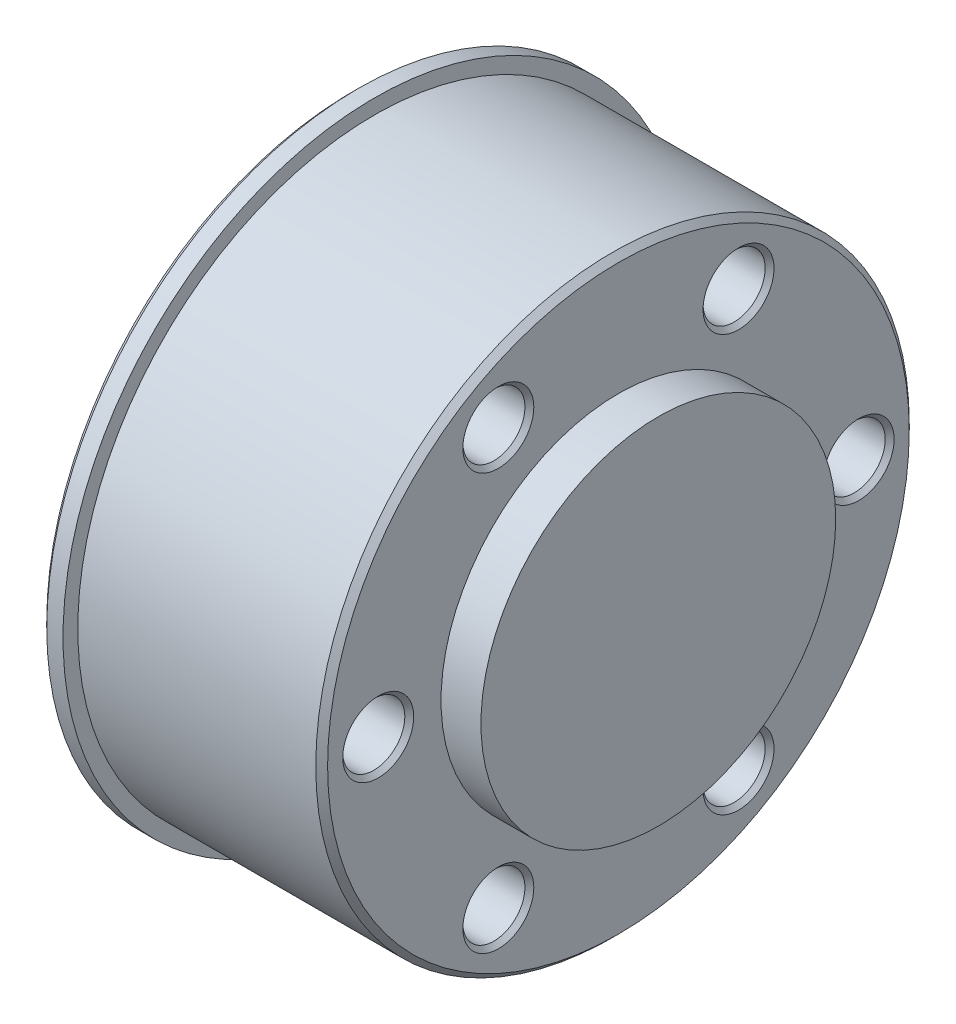
ISO-10303-21;
HEADER;
FILE_DESCRIPTION(('STEP AP214'),'2;1');
FILE_NAME('part.step','',(''),(''),'','','');
FILE_SCHEMA(('AUTOMOTIVE_DESIGN { 1 0 10303 214 1 1 1 1 }'));
ENDSEC;
DATA;
#1=APPLICATION_CONTEXT('core data for automotive mechanical design processes');
#2=APPLICATION_PROTOCOL_DEFINITION('international standard','automotive_design',2000,#1);
#3=PRODUCT_CONTEXT('',#1,'mechanical');
#4=PRODUCT('Part','Part','',(#3));
#5=PRODUCT_RELATED_PRODUCT_CATEGORY('part','',(#4));
#6=PRODUCT_DEFINITION_FORMATION('','',#4);
#7=PRODUCT_DEFINITION_CONTEXT('part definition',#1,'design');
#8=PRODUCT_DEFINITION('design','',#6,#7);
#9=PRODUCT_DEFINITION_SHAPE('','',#8);
#10=(LENGTH_UNIT() NAMED_UNIT(*) SI_UNIT(.MILLI.,.METRE.));
#11=(NAMED_UNIT(*) PLANE_ANGLE_UNIT() SI_UNIT($,.RADIAN.));
#12=(NAMED_UNIT(*) SI_UNIT($,.STERADIAN.) SOLID_ANGLE_UNIT());
#13=UNCERTAINTY_MEASURE_WITH_UNIT(LENGTH_MEASURE(1.E-05),#10,'distance_accuracy_value','');
#14=(GEOMETRIC_REPRESENTATION_CONTEXT(3) GLOBAL_UNCERTAINTY_ASSIGNED_CONTEXT((#13)) GLOBAL_UNIT_ASSIGNED_CONTEXT((#10,
#11,#12)) REPRESENTATION_CONTEXT('',''));
#15=CARTESIAN_POINT('',(0.,0.,0.));
#16=DIRECTION('',(0.,0.,1.));
#17=DIRECTION('',(1.,0.,0.));
#18=AXIS2_PLACEMENT_3D('',#15,#16,#17);
#19=CARTESIAN_POINT('',(0.,0.,0.));
#20=DIRECTION('',(1.,0.,0.));
#21=DIRECTION('',(0.,0.,-1.));
#22=AXIS2_PLACEMENT_3D('',#19,#20,#21);
#23=PLANE('',#22);
#24=CARTESIAN_POINT('',(0.,0.,0.));
#25=DIRECTION('',(1.,0.,0.));
#26=DIRECTION('',(0.,0.,-1.));
#27=AXIS2_PLACEMENT_3D('',#24,#25,#26);
#28=CIRCLE('',#27,12.);
#29=CARTESIAN_POINT('',(0.,0.,-12.));
#30=VERTEX_POINT('',#29);
#31=EDGE_CURVE('E174',#30,#30,#28,.T.);
#32=ORIENTED_EDGE('',*,*,#31,.T.);
#33=EDGE_LOOP('',(#32));
#34=FACE_BOUND('',#33,.T.);
#35=ADVANCED_FACE('F45',(#34),#23,.T.);
#36=CARTESIAN_POINT('',(0.,0.,0.));
#37=DIRECTION('',(1.,0.,0.));
#38=DIRECTION('',(0.,0.,-1.));
#39=AXIS2_PLACEMENT_3D('',#36,#37,#38);
#40=CYLINDRICAL_SURFACE('',#39,12.);
#41=CARTESIAN_POINT('',(-2.7,0.,0.));
#42=DIRECTION('',(1.,0.,0.));
#43=DIRECTION('',(0.,0.,-1.));
#44=AXIS2_PLACEMENT_3D('',#41,#42,#43);
#45=CIRCLE('',#44,12.);
#46=CARTESIAN_POINT('',(-2.7,0.,-12.));
#47=VERTEX_POINT('',#46);
#48=EDGE_CURVE('E178',#47,#47,#45,.T.);
#49=ORIENTED_EDGE('',*,*,#48,.T.);
#50=EDGE_LOOP('',(#49));
#51=FACE_BOUND('',#50,.T.);
#52=ORIENTED_EDGE('',*,*,#31,.F.);
#53=EDGE_LOOP('',(#52));
#54=FACE_BOUND('',#53,.T.);
#55=ADVANCED_FACE('F270',(#51,#54),#40,.T.);
#56=CARTESIAN_POINT('',(-2.7,0.,-12.));
#57=DIRECTION('',(1.,0.,0.));
#58=DIRECTION('',(0.,0.,-1.));
#59=AXIS2_PLACEMENT_3D('',#56,#57,#58);
#60=PLANE('',#59);
#61=CARTESIAN_POINT('',(-2.7,-14.0729128114974,-8.12499999999992));
#62=DIRECTION('',(1.,0.,0.));
#63=DIRECTION('',(0.,0.,-1.));
#64=AXIS2_PLACEMENT_3D('',#61,#62,#63);
#65=CIRCLE('',#64,2.40000000000015);
#66=CARTESIAN_POINT('',(-2.7,-14.0729128114974,-10.5250000000001));
#67=VERTEX_POINT('',#66);
#68=EDGE_CURVE('E82',#67,#67,#65,.F.);
#69=ORIENTED_EDGE('',*,*,#68,.T.);
#70=EDGE_LOOP('',(#69));
#71=FACE_BOUND('',#70,.T.);
#72=CARTESIAN_POINT('',(-2.7,-2.4980018054066E-13,-16.2500000000001));
#73=DIRECTION('',(1.,0.,0.));
#74=DIRECTION('',(0.,0.,-1.));
#75=AXIS2_PLACEMENT_3D('',#72,#73,#74);
#76=CIRCLE('',#75,2.39999999999988);
#77=CARTESIAN_POINT('',(-2.7,-2.4980018054066E-13,-18.65));
#78=VERTEX_POINT('',#77);
#79=EDGE_CURVE('E86',#78,#78,#76,.F.);
#80=ORIENTED_EDGE('',*,*,#79,.T.);
#81=EDGE_LOOP('',(#80));
#82=FACE_BOUND('',#81,.T.);
#83=CARTESIAN_POINT('',(-2.7,14.072912811497,-8.12500000000025));
#84=DIRECTION('',(1.,0.,0.));
#85=DIRECTION('',(0.,0.,-1.));
#86=AXIS2_PLACEMENT_3D('',#83,#84,#85);
#87=CIRCLE('',#86,2.39999999999986);
#88=CARTESIAN_POINT('',(-2.7,14.072912811497,-10.5250000000001));
#89=VERTEX_POINT('',#88);
#90=EDGE_CURVE('E90',#89,#89,#87,.F.);
#91=ORIENTED_EDGE('',*,*,#90,.T.);
#92=EDGE_LOOP('',(#91));
#93=FACE_BOUND('',#92,.T.);
#94=CARTESIAN_POINT('',(-2.7,14.0729128114972,8.12499999999992));
#95=DIRECTION('',(1.,0.,0.));
#96=DIRECTION('',(0.,0.,-1.));
#97=AXIS2_PLACEMENT_3D('',#94,#95,#96);
#98=CIRCLE('',#97,2.4);
#99=CARTESIAN_POINT('',(-2.7,14.0729128114972,5.72499999999992));
#100=VERTEX_POINT('',#99);
#101=EDGE_CURVE('E94',#100,#100,#98,.F.);
#102=ORIENTED_EDGE('',*,*,#101,.T.);
#103=EDGE_LOOP('',(#102));
#104=FACE_BOUND('',#103,.T.);
#105=CARTESIAN_POINT('',(-2.7,-14.0729128114972,8.12500000000017));
#106=DIRECTION('',(1.,0.,0.));
#107=DIRECTION('',(0.,0.,-1.));
#108=AXIS2_PLACEMENT_3D('',#105,#106,#107);
#109=CIRCLE('',#108,2.40000000000038);
#110=CARTESIAN_POINT('',(-2.7,-14.0729128114972,5.72499999999979));
#111=VERTEX_POINT('',#110);
#112=EDGE_CURVE('E98',#111,#111,#109,.F.);
#113=ORIENTED_EDGE('',*,*,#112,.T.);
#114=EDGE_LOOP('',(#113));
#115=FACE_BOUND('',#114,.T.);
#116=CARTESIAN_POINT('',(-2.7,1.83880688453542E-13,16.2499999999998));
#117=DIRECTION('',(1.,0.,0.));
#118=DIRECTION('',(0.,0.,-1.));
#119=AXIS2_PLACEMENT_3D('',#116,#117,#118);
#120=CIRCLE('',#119,2.4);
#121=CARTESIAN_POINT('',(-2.7,1.83880688453542E-13,13.8499999999998));
#122=VERTEX_POINT('',#121);
#123=EDGE_CURVE('E102',#122,#122,#120,.F.);
#124=ORIENTED_EDGE('',*,*,#123,.T.);
#125=EDGE_LOOP('',(#124));
#126=FACE_BOUND('',#125,.T.);
#127=CARTESIAN_POINT('',(-2.7,0.,0.));
#128=DIRECTION('',(1.,0.,0.));
#129=DIRECTION('',(0.,0.,-1.));
#130=AXIS2_PLACEMENT_3D('',#127,#128,#129);
#131=CIRCLE('',#130,19.675);
#132=CARTESIAN_POINT('',(-2.7,0.,19.675));
#133=VERTEX_POINT('',#132);
#134=EDGE_CURVE('E170',#133,#133,#131,.T.);
#135=ORIENTED_EDGE('',*,*,#134,.T.);
#136=EDGE_LOOP('',(#135));
#137=FACE_BOUND('',#136,.T.);
#138=ORIENTED_EDGE('',*,*,#48,.F.);
#139=EDGE_LOOP('',(#138));
#140=FACE_BOUND('',#139,.T.);
#141=ADVANCED_FACE('F276',(#71,#82,#93,#104,#115,#126,#137,#140),#60,.T.);
#142=CARTESIAN_POINT('',(0.,0.,0.));
#143=DIRECTION('',(1.,0.,0.));
#144=DIRECTION('',(0.,0.,-1.));
#145=AXIS2_PLACEMENT_3D('',#142,#143,#144);
#146=CYLINDRICAL_SURFACE('',#145,20.075);
#147=CARTESIAN_POINT('',(-3.09999999999998,0.,0.));
#148=DIRECTION('',(1.,0.,0.));
#149=DIRECTION('',(0.,0.,-1.));
#150=AXIS2_PLACEMENT_3D('',#147,#148,#149);
#151=CIRCLE('',#150,20.075);
#152=CARTESIAN_POINT('',(-3.09999999999998,0.,20.075));
#153=VERTEX_POINT('',#152);
#154=EDGE_CURVE('E166',#153,#153,#151,.F.);
#155=ORIENTED_EDGE('',*,*,#154,.T.);
#156=EDGE_LOOP('',(#155));
#157=FACE_BOUND('',#156,.T.);
#158=CARTESIAN_POINT('',(-19.2,0.,0.));
#159=DIRECTION('',(1.,0.,0.));
#160=DIRECTION('',(0.,0.,-1.));
#161=AXIS2_PLACEMENT_3D('',#158,#159,#160);
#162=CIRCLE('',#161,20.075);
#163=CARTESIAN_POINT('',(-19.2,0.,-20.075));
#164=VERTEX_POINT('',#163);
#165=EDGE_CURVE('E182',#164,#164,#162,.T.);
#166=ORIENTED_EDGE('',*,*,#165,.T.);
#167=EDGE_LOOP('',(#166));
#168=FACE_BOUND('',#167,.T.);
#169=ADVANCED_FACE('F476',(#157,#168),#146,.T.);
#170=CARTESIAN_POINT('',(-19.2,0.,-20.075));
#171=DIRECTION('',(1.,0.,0.));
#172=DIRECTION('',(0.,0.,-1.));
#173=AXIS2_PLACEMENT_3D('',#170,#171,#172);
#174=PLANE('',#173);
#175=CARTESIAN_POINT('',(-19.2,0.,0.));
#176=DIRECTION('',(1.,0.,0.));
#177=DIRECTION('',(0.,0.,-1.));
#178=AXIS2_PLACEMENT_3D('',#175,#176,#177);
#179=CIRCLE('',#178,21.075);
#180=CARTESIAN_POINT('',(-19.2,0.,-21.075));
#181=VERTEX_POINT('',#180);
#182=EDGE_CURVE('E186',#181,#181,#179,.T.);
#183=ORIENTED_EDGE('',*,*,#182,.T.);
#184=EDGE_LOOP('',(#183));
#185=FACE_BOUND('',#184,.T.);
#186=ORIENTED_EDGE('',*,*,#165,.F.);
#187=EDGE_LOOP('',(#186));
#188=FACE_BOUND('',#187,.T.);
#189=ADVANCED_FACE('F473',(#185,#188),#174,.T.);
#190=CARTESIAN_POINT('',(0.,0.,0.));
#191=DIRECTION('',(1.,0.,0.));
#192=DIRECTION('',(0.,0.,-1.));
#193=AXIS2_PLACEMENT_3D('',#190,#191,#192);
#194=CYLINDRICAL_SURFACE('',#193,21.075);
#195=CARTESIAN_POINT('',(-20.3,0.,0.));
#196=DIRECTION('',(-1.,0.,0.));
#197=DIRECTION('',(0.,0.,1.));
#198=AXIS2_PLACEMENT_3D('',#195,#196,#197);
#199=CIRCLE('',#198,21.075);
#200=CARTESIAN_POINT('',(-20.3,0.,21.075));
#201=VERTEX_POINT('',#200);
#202=EDGE_CURVE('E54',#201,#201,#199,.F.);
#203=ORIENTED_EDGE('',*,*,#202,.T.);
#204=EDGE_LOOP('',(#203));
#205=FACE_BOUND('',#204,.T.);
#206=ORIENTED_EDGE('',*,*,#182,.F.);
#207=EDGE_LOOP('',(#206));
#208=FACE_BOUND('',#207,.T.);
#209=ADVANCED_FACE('F471',(#205,#208),#194,.T.);
#210=CARTESIAN_POINT('',(-20.7,0.,-14.575));
#211=DIRECTION('',(-1.,0.,0.));
#212=DIRECTION('',(0.,0.,1.));
#213=AXIS2_PLACEMENT_3D('',#210,#211,#212);
#214=PLANE('',#213);
#215=CARTESIAN_POINT('',(-20.7,0.,0.));
#216=DIRECTION('',(-1.,0.,0.));
#217=DIRECTION('',(0.,0.,1.));
#218=AXIS2_PLACEMENT_3D('',#215,#216,#217);
#219=CIRCLE('',#218,20.675);
#220=CARTESIAN_POINT('',(-20.7,0.,20.675));
#221=VERTEX_POINT('',#220);
#222=EDGE_CURVE('E10',#221,#221,#219,.T.);
#223=ORIENTED_EDGE('',*,*,#222,.T.);
#224=EDGE_LOOP('',(#223));
#225=FACE_BOUND('',#224,.T.);
#226=CARTESIAN_POINT('',(-20.7,-16.0952701943601,-0.165012817078659));
#227=DIRECTION('',(-1.,0.,0.));
#228=DIRECTION('',(0.,0.,1.));
#229=AXIS2_PLACEMENT_3D('',#226,#227,#228);
#230=CIRCLE('',#229,2.025);
#231=CARTESIAN_POINT('',(-20.7,-16.0952701943601,1.85998718292134));
#232=VERTEX_POINT('',#231);
#233=EDGE_CURVE('E130',#232,#232,#230,.F.);
#234=ORIENTED_EDGE('',*,*,#233,.T.);
#235=EDGE_LOOP('',(#234));
#236=FACE_BOUND('',#235,.T.);
#237=CARTESIAN_POINT('',(-20.7,-8.00000000000001,-14.0214192776297));
#238=DIRECTION('',(-1.,0.,0.));
#239=DIRECTION('',(0.,0.,1.));
#240=AXIS2_PLACEMENT_3D('',#237,#238,#239);
#241=CIRCLE('',#240,2.02500000000001);
#242=CARTESIAN_POINT('',(-20.7,-8.00000000000001,-11.9964192776297));
#243=VERTEX_POINT('',#242);
#244=EDGE_CURVE('E134',#243,#243,#241,.F.);
#245=ORIENTED_EDGE('',*,*,#244,.T.);
#246=EDGE_LOOP('',(#245));
#247=FACE_BOUND('',#246,.T.);
#248=CARTESIAN_POINT('',(-20.7,8.04763509718006,-13.9389128690904));
#249=DIRECTION('',(-1.,0.,0.));
#250=DIRECTION('',(0.,0.,1.));
#251=AXIS2_PLACEMENT_3D('',#248,#249,#250);
#252=CIRCLE('',#251,2.02500000000001);
#253=CARTESIAN_POINT('',(-20.7,8.04763509718006,-11.9139128690903));
#254=VERTEX_POINT('',#253);
#255=EDGE_CURVE('E138',#254,#254,#252,.F.);
#256=ORIENTED_EDGE('',*,*,#255,.T.);
#257=EDGE_LOOP('',(#256));
#258=FACE_BOUND('',#257,.T.);
#259=CARTESIAN_POINT('',(-20.7,-8.14290529154015,13.7739000520117));
#260=DIRECTION('',(-1.,0.,0.));
#261=DIRECTION('',(0.,0.,1.));
#262=AXIS2_PLACEMENT_3D('',#259,#260,#261);
#263=CIRCLE('',#262,2.02500000000001);
#264=CARTESIAN_POINT('',(-20.7,-8.14290529154015,15.7989000520117));
#265=VERTEX_POINT('',#264);
#266=EDGE_CURVE('E142',#265,#265,#263,.F.);
#267=ORIENTED_EDGE('',*,*,#266,.T.);
#268=EDGE_LOOP('',(#267));
#269=FACE_BOUND('',#268,.T.);
#270=CARTESIAN_POINT('',(-20.7,7.9047298056399,13.856406460551));
#271=DIRECTION('',(-1.,0.,0.));
#272=DIRECTION('',(0.,0.,1.));
#273=AXIS2_PLACEMENT_3D('',#270,#271,#272);
#274=CIRCLE('',#273,2.02500000000001);
#275=CARTESIAN_POINT('',(-20.7,7.9047298056399,15.881406460551));
#276=VERTEX_POINT('',#275);
#277=EDGE_CURVE('E146',#276,#276,#274,.F.);
#278=ORIENTED_EDGE('',*,*,#277,.T.);
#279=EDGE_LOOP('',(#278));
#280=FACE_BOUND('',#279,.T.);
#281=CARTESIAN_POINT('',(-20.7,16.,0.));
#282=DIRECTION('',(-1.,0.,0.));
#283=DIRECTION('',(0.,0.,1.));
#284=AXIS2_PLACEMENT_3D('',#281,#282,#283);
#285=CIRCLE('',#284,2.02500000000001);
#286=CARTESIAN_POINT('',(-20.7,16.,2.02500000000001));
#287=VERTEX_POINT('',#286);
#288=EDGE_CURVE('E150',#287,#287,#285,.F.);
#289=ORIENTED_EDGE('',*,*,#288,.T.);
#290=EDGE_LOOP('',(#289));
#291=FACE_BOUND('',#290,.T.);
#292=CARTESIAN_POINT('',(-20.7,0.,0.));
#293=DIRECTION('',(-1.,0.,0.));
#294=DIRECTION('',(0.,0.,1.));
#295=AXIS2_PLACEMENT_3D('',#292,#293,#294);
#296=CIRCLE('',#295,8.50000000000001);
#297=CARTESIAN_POINT('',(-20.7,0.,8.50000000000001));
#298=VERTEX_POINT('',#297);
#299=EDGE_CURVE('E162',#298,#298,#296,.F.);
#300=ORIENTED_EDGE('',*,*,#299,.T.);
#301=EDGE_LOOP('',(#300));
#302=FACE_BOUND('',#301,.T.);
#303=ADVANCED_FACE('F467',(#225,#236,#247,#258,#269,#280,#291,#302),#214,.T.);
#304=CARTESIAN_POINT('',(0.,0.,0.));
#305=DIRECTION('',(1.,0.,0.));
#306=DIRECTION('',(0.,0.,-1.));
#307=AXIS2_PLACEMENT_3D('',#304,#305,#306);
#308=CYLINDRICAL_SURFACE('',#307,8.1);
#309=CARTESIAN_POINT('',(-20.3,0.,0.));
#310=DIRECTION('',(-1.,0.,0.));
#311=DIRECTION('',(0.,0.,1.));
#312=AXIS2_PLACEMENT_3D('',#309,#310,#311);
#313=CIRCLE('',#312,8.1);
#314=CARTESIAN_POINT('',(-20.3,0.,8.1));
#315=VERTEX_POINT('',#314);
#316=EDGE_CURVE('E158',#315,#315,#313,.T.);
#317=ORIENTED_EDGE('',*,*,#316,.T.);
#318=EDGE_LOOP('',(#317));
#319=FACE_BOUND('',#318,.T.);
#320=CARTESIAN_POINT('',(-15.7,0.,0.));
#321=DIRECTION('',(1.,0.,0.));
#322=DIRECTION('',(0.,0.,-1.));
#323=AXIS2_PLACEMENT_3D('',#320,#321,#322);
#324=CIRCLE('',#323,8.1);
#325=CARTESIAN_POINT('',(-15.7,0.,-8.1));
#326=VERTEX_POINT('',#325);
#327=EDGE_CURVE('E190',#326,#326,#324,.T.);
#328=ORIENTED_EDGE('',*,*,#327,.T.);
#329=EDGE_LOOP('',(#328));
#330=FACE_BOUND('',#329,.T.);
#331=ADVANCED_FACE('F463',(#319,#330),#308,.F.);
#332=CARTESIAN_POINT('',(-15.7,0.,-8.1));
#333=DIRECTION('',(-1.,0.,0.));
#334=DIRECTION('',(0.,0.,1.));
#335=AXIS2_PLACEMENT_3D('',#332,#333,#334);
#336=PLANE('',#335);
#337=CARTESIAN_POINT('',(-15.7,0.,0.));
#338=DIRECTION('',(1.,0.,0.));
#339=DIRECTION('',(0.,0.,-1.));
#340=AXIS2_PLACEMENT_3D('',#337,#338,#339);
#341=CIRCLE('',#340,6.);
#342=CARTESIAN_POINT('',(-15.7,0.,-6.));
#343=VERTEX_POINT('',#342);
#344=EDGE_CURVE('E194',#343,#343,#341,.T.);
#345=ORIENTED_EDGE('',*,*,#344,.T.);
#346=EDGE_LOOP('',(#345));
#347=FACE_BOUND('',#346,.T.);
#348=ORIENTED_EDGE('',*,*,#327,.F.);
#349=EDGE_LOOP('',(#348));
#350=FACE_BOUND('',#349,.T.);
#351=ADVANCED_FACE('F459',(#347,#350),#336,.T.);
#352=CARTESIAN_POINT('',(0.,0.,0.));
#353=DIRECTION('',(1.,0.,0.));
#354=DIRECTION('',(0.,0.,-1.));
#355=AXIS2_PLACEMENT_3D('',#352,#353,#354);
#356=CYLINDRICAL_SURFACE('',#355,6.);
#357=CARTESIAN_POINT('',(-13.7,0.,0.));
#358=DIRECTION('',(1.,0.,0.));
#359=DIRECTION('',(0.,0.,-1.));
#360=AXIS2_PLACEMENT_3D('',#357,#358,#359);
#361=CIRCLE('',#360,6.);
#362=CARTESIAN_POINT('',(-13.7,0.,-6.));
#363=VERTEX_POINT('',#362);
#364=EDGE_CURVE('E198',#363,#363,#361,.T.);
#365=ORIENTED_EDGE('',*,*,#364,.T.);
#366=EDGE_LOOP('',(#365));
#367=FACE_BOUND('',#366,.T.);
#368=ORIENTED_EDGE('',*,*,#344,.F.);
#369=EDGE_LOOP('',(#368));
#370=FACE_BOUND('',#369,.T.);
#371=ADVANCED_FACE('F455',(#367,#370),#356,.F.);
#372=CARTESIAN_POINT('',(-13.7,0.,-6.));
#373=DIRECTION('',(-1.,0.,0.));
#374=DIRECTION('',(0.,0.,1.));
#375=AXIS2_PLACEMENT_3D('',#372,#373,#374);
#376=PLANE('',#375);
#377=ORIENTED_EDGE('',*,*,#364,.F.);
#378=EDGE_LOOP('',(#377));
#379=FACE_BOUND('',#378,.T.);
#380=ADVANCED_FACE('F425',(#379),#376,.T.);
#381=CARTESIAN_POINT('',(-8.7,7.9047298056399,13.856406460551));
#382=DIRECTION('',(-1.,0.,0.));
#383=DIRECTION('',(0.,0.,1.));
#384=AXIS2_PLACEMENT_3D('',#381,#382,#383);
#385=CYLINDRICAL_SURFACE('',#384,1.625);
#386=CARTESIAN_POINT('',(-20.3,7.9047298056399,13.856406460551));
#387=DIRECTION('',(-1.,0.,0.));
#388=DIRECTION('',(0.,0.,1.));
#389=AXIS2_PLACEMENT_3D('',#386,#387,#388);
#390=CIRCLE('',#389,1.625);
#391=CARTESIAN_POINT('',(-20.3,7.9047298056399,15.481406460551));
#392=VERTEX_POINT('',#391);
#393=EDGE_CURVE('E114',#392,#392,#390,.T.);
#394=ORIENTED_EDGE('',*,*,#393,.T.);
#395=EDGE_LOOP('',(#394));
#396=FACE_BOUND('',#395,.T.);
#397=CARTESIAN_POINT('',(-8.7,7.9047298056399,13.856406460551));
#398=DIRECTION('',(-1.,0.,0.));
#399=DIRECTION('',(0.,0.,1.));
#400=AXIS2_PLACEMENT_3D('',#397,#398,#399);
#401=CIRCLE('',#400,1.625);
#402=CARTESIAN_POINT('',(-8.7,7.9047298056399,15.481406460551));
#403=VERTEX_POINT('',#402);
#404=EDGE_CURVE('E216',#403,#403,#401,.T.);
#405=ORIENTED_EDGE('',*,*,#404,.F.);
#406=EDGE_LOOP('',(#405));
#407=FACE_BOUND('',#406,.T.);
#408=ADVANCED_FACE('F421',(#396,#407),#385,.F.);
#409=CARTESIAN_POINT('',(-8.7,7.9047298056399,13.856406460551));
#410=DIRECTION('',(-1.,0.,0.));
#411=DIRECTION('',(0.,0.,1.));
#412=AXIS2_PLACEMENT_3D('',#409,#410,#411);
#413=PLANE('',#412);
#414=ORIENTED_EDGE('',*,*,#404,.T.);
#415=EDGE_LOOP('',(#414));
#416=FACE_BOUND('',#415,.T.);
#417=ADVANCED_FACE('F424',(#416),#413,.T.);
#418=CARTESIAN_POINT('',(-8.7,-8.14290529154015,13.7739000520117));
#419=DIRECTION('',(-1.,0.,0.));
#420=DIRECTION('',(0.,0.,1.));
#421=AXIS2_PLACEMENT_3D('',#418,#419,#420);
#422=CYLINDRICAL_SURFACE('',#421,1.625);
#423=CARTESIAN_POINT('',(-20.3,-8.14290529154015,13.7739000520117));
#424=DIRECTION('',(-1.,0.,0.));
#425=DIRECTION('',(0.,0.,1.));
#426=AXIS2_PLACEMENT_3D('',#423,#424,#425);
#427=CIRCLE('',#426,1.625);
#428=CARTESIAN_POINT('',(-20.3,-8.14290529154015,15.3989000520117));
#429=VERTEX_POINT('',#428);
#430=EDGE_CURVE('E118',#429,#429,#427,.T.);
#431=ORIENTED_EDGE('',*,*,#430,.T.);
#432=EDGE_LOOP('',(#431));
#433=FACE_BOUND('',#432,.T.);
#434=CARTESIAN_POINT('',(-8.7,-8.14290529154015,13.7739000520117));
#435=DIRECTION('',(-1.,0.,0.));
#436=DIRECTION('',(0.,0.,1.));
#437=AXIS2_PLACEMENT_3D('',#434,#435,#436);
#438=CIRCLE('',#437,1.625);
#439=CARTESIAN_POINT('',(-8.7,-8.14290529154015,15.3989000520117));
#440=VERTEX_POINT('',#439);
#441=EDGE_CURVE('E212',#440,#440,#438,.T.);
#442=ORIENTED_EDGE('',*,*,#441,.F.);
#443=EDGE_LOOP('',(#442));
#444=FACE_BOUND('',#443,.T.);
#445=ADVANCED_FACE('F429',(#433,#444),#422,.F.);
#446=CARTESIAN_POINT('',(-8.7,-8.14290529154015,13.7739000520117));
#447=DIRECTION('',(-1.,0.,0.));
#448=DIRECTION('',(0.,0.,1.));
#449=AXIS2_PLACEMENT_3D('',#446,#447,#448);
#450=PLANE('',#449);
#451=ORIENTED_EDGE('',*,*,#441,.T.);
#452=EDGE_LOOP('',(#451));
#453=FACE_BOUND('',#452,.T.);
#454=ADVANCED_FACE('F433',(#453),#450,.T.);
#455=CARTESIAN_POINT('',(-8.7,-16.0952701943601,-0.165012817078659));
#456=DIRECTION('',(-1.,0.,0.));
#457=DIRECTION('',(0.,0.,1.));
#458=AXIS2_PLACEMENT_3D('',#455,#456,#457);
#459=CYLINDRICAL_SURFACE('',#458,1.625);
#460=CARTESIAN_POINT('',(-20.3,-16.0952701943601,-0.165012817078659));
#461=DIRECTION('',(-1.,0.,0.));
#462=DIRECTION('',(0.,0.,1.));
#463=AXIS2_PLACEMENT_3D('',#460,#461,#462);
#464=CIRCLE('',#463,1.625);
#465=CARTESIAN_POINT('',(-20.3,-16.0952701943601,1.45998718292134));
#466=VERTEX_POINT('',#465);
#467=EDGE_CURVE('E154',#466,#466,#464,.T.);
#468=ORIENTED_EDGE('',*,*,#467,.T.);
#469=EDGE_LOOP('',(#468));
#470=FACE_BOUND('',#469,.T.);
#471=CARTESIAN_POINT('',(-8.7,-16.0952701943601,-0.165012817078659));
#472=DIRECTION('',(-1.,0.,0.));
#473=DIRECTION('',(0.,0.,1.));
#474=AXIS2_PLACEMENT_3D('',#471,#472,#473);
#475=CIRCLE('',#474,1.625);
#476=CARTESIAN_POINT('',(-8.7,-16.0952701943601,1.45998718292134));
#477=VERTEX_POINT('',#476);
#478=EDGE_CURVE('E207',#477,#477,#475,.T.);
#479=ORIENTED_EDGE('',*,*,#478,.F.);
#480=EDGE_LOOP('',(#479));
#481=FACE_BOUND('',#480,.T.);
#482=ADVANCED_FACE('F437',(#470,#481),#459,.F.);
#483=CARTESIAN_POINT('',(-8.7,-16.0952701943601,-0.165012817078659));
#484=DIRECTION('',(-1.,0.,0.));
#485=DIRECTION('',(0.,0.,1.));
#486=AXIS2_PLACEMENT_3D('',#483,#484,#485);
#487=PLANE('',#486);
#488=ORIENTED_EDGE('',*,*,#478,.T.);
#489=EDGE_LOOP('',(#488));
#490=FACE_BOUND('',#489,.T.);
#491=ADVANCED_FACE('F441',(#490),#487,.T.);
#492=CARTESIAN_POINT('',(-8.7,-8.00000000000001,-14.0214192776297));
#493=DIRECTION('',(-1.,0.,0.));
#494=DIRECTION('',(0.,0.,1.));
#495=AXIS2_PLACEMENT_3D('',#492,#493,#494);
#496=CYLINDRICAL_SURFACE('',#495,1.625);
#497=CARTESIAN_POINT('',(-20.3,-8.00000000000001,-14.0214192776297));
#498=DIRECTION('',(-1.,0.,0.));
#499=DIRECTION('',(0.,0.,1.));
#500=AXIS2_PLACEMENT_3D('',#497,#498,#499);
#501=CIRCLE('',#500,1.625);
#502=CARTESIAN_POINT('',(-20.3,-8.00000000000001,-12.3964192776297));
#503=VERTEX_POINT('',#502);
#504=EDGE_CURVE('E126',#503,#503,#501,.T.);
#505=ORIENTED_EDGE('',*,*,#504,.T.);
#506=EDGE_LOOP('',(#505));
#507=FACE_BOUND('',#506,.T.);
#508=CARTESIAN_POINT('',(-8.7,-8.00000000000001,-14.0214192776297));
#509=DIRECTION('',(-1.,0.,0.));
#510=DIRECTION('',(0.,0.,1.));
#511=AXIS2_PLACEMENT_3D('',#508,#509,#510);
#512=CIRCLE('',#511,1.625);
#513=CARTESIAN_POINT('',(-8.7,-8.00000000000001,-12.3964192776297));
#514=VERTEX_POINT('',#513);
#515=EDGE_CURVE('E203',#514,#514,#512,.T.);
#516=ORIENTED_EDGE('',*,*,#515,.F.);
#517=EDGE_LOOP('',(#516));
#518=FACE_BOUND('',#517,.T.);
#519=ADVANCED_FACE('F445',(#507,#518),#496,.F.);
#520=CARTESIAN_POINT('',(-8.7,-8.00000000000001,-14.0214192776297));
#521=DIRECTION('',(-1.,0.,0.));
#522=DIRECTION('',(0.,0.,1.));
#523=AXIS2_PLACEMENT_3D('',#520,#521,#522);
#524=PLANE('',#523);
#525=ORIENTED_EDGE('',*,*,#515,.T.);
#526=EDGE_LOOP('',(#525));
#527=FACE_BOUND('',#526,.T.);
#528=ADVANCED_FACE('F416',(#527),#524,.T.);
#529=CARTESIAN_POINT('',(-8.7,8.04763509718006,-13.9389128690904));
#530=DIRECTION('',(-1.,0.,0.));
#531=DIRECTION('',(0.,0.,1.));
#532=AXIS2_PLACEMENT_3D('',#529,#530,#531);
#533=CYLINDRICAL_SURFACE('',#532,1.625);
#534=CARTESIAN_POINT('',(-20.3,8.04763509718006,-13.9389128690904));
#535=DIRECTION('',(-1.,0.,0.));
#536=DIRECTION('',(0.,0.,1.));
#537=AXIS2_PLACEMENT_3D('',#534,#535,#536);
#538=CIRCLE('',#537,1.625);
#539=CARTESIAN_POINT('',(-20.3,8.04763509718006,-12.3139128690904));
#540=VERTEX_POINT('',#539);
#541=EDGE_CURVE('E122',#540,#540,#538,.T.);
#542=ORIENTED_EDGE('',*,*,#541,.T.);
#543=EDGE_LOOP('',(#542));
#544=FACE_BOUND('',#543,.T.);
#545=CARTESIAN_POINT('',(-8.7,8.04763509718006,-13.9389128690904));
#546=DIRECTION('',(-1.,0.,0.));
#547=DIRECTION('',(0.,0.,1.));
#548=AXIS2_PLACEMENT_3D('',#545,#546,#547);
#549=CIRCLE('',#548,1.625);
#550=CARTESIAN_POINT('',(-8.7,8.04763509718006,-12.3139128690904));
#551=VERTEX_POINT('',#550);
#552=EDGE_CURVE('E208',#551,#551,#549,.T.);
#553=ORIENTED_EDGE('',*,*,#552,.F.);
#554=EDGE_LOOP('',(#553));
#555=FACE_BOUND('',#554,.T.);
#556=ADVANCED_FACE('F413',(#544,#555),#533,.F.);
#557=CARTESIAN_POINT('',(-8.7,8.04763509718006,-13.9389128690904));
#558=DIRECTION('',(-1.,0.,0.));
#559=DIRECTION('',(0.,0.,1.));
#560=AXIS2_PLACEMENT_3D('',#557,#558,#559);
#561=PLANE('',#560);
#562=ORIENTED_EDGE('',*,*,#552,.T.);
#563=EDGE_LOOP('',(#562));
#564=FACE_BOUND('',#563,.T.);
#565=ADVANCED_FACE('F411',(#564),#561,.T.);
#566=CARTESIAN_POINT('',(-8.7,16.,0.));
#567=DIRECTION('',(-1.,0.,0.));
#568=DIRECTION('',(0.,0.,1.));
#569=AXIS2_PLACEMENT_3D('',#566,#567,#568);
#570=CYLINDRICAL_SURFACE('',#569,1.625);
#571=CARTESIAN_POINT('',(-20.3,16.,0.));
#572=DIRECTION('',(-1.,0.,0.));
#573=DIRECTION('',(0.,0.,1.));
#574=AXIS2_PLACEMENT_3D('',#571,#572,#573);
#575=CIRCLE('',#574,1.625);
#576=CARTESIAN_POINT('',(-20.3,16.,1.625));
#577=VERTEX_POINT('',#576);
#578=EDGE_CURVE('E110',#577,#577,#575,.T.);
#579=ORIENTED_EDGE('',*,*,#578,.T.);
#580=EDGE_LOOP('',(#579));
#581=FACE_BOUND('',#580,.T.);
#582=CARTESIAN_POINT('',(-8.7,16.,0.));
#583=DIRECTION('',(-1.,0.,0.));
#584=DIRECTION('',(0.,0.,1.));
#585=AXIS2_PLACEMENT_3D('',#582,#583,#584);
#586=CIRCLE('',#585,1.625);
#587=CARTESIAN_POINT('',(-8.7,16.,1.625));
#588=VERTEX_POINT('',#587);
#589=EDGE_CURVE('E202',#588,#588,#586,.T.);
#590=ORIENTED_EDGE('',*,*,#589,.F.);
#591=EDGE_LOOP('',(#590));
#592=FACE_BOUND('',#591,.T.);
#593=ADVANCED_FACE('F407',(#581,#592),#570,.F.);
#594=CARTESIAN_POINT('',(-8.7,16.,0.));
#595=DIRECTION('',(-1.,0.,0.));
#596=DIRECTION('',(0.,0.,1.));
#597=AXIS2_PLACEMENT_3D('',#594,#595,#596);
#598=PLANE('',#597);
#599=ORIENTED_EDGE('',*,*,#589,.T.);
#600=EDGE_LOOP('',(#599));
#601=FACE_BOUND('',#600,.T.);
#602=ADVANCED_FACE('F403',(#601),#598,.T.);
#603=CARTESIAN_POINT('',(-12.7,14.0729128114972,8.12499999999992));
#604=DIRECTION('',(1.,0.,0.));
#605=DIRECTION('',(0.,0.,-1.));
#606=AXIS2_PLACEMENT_3D('',#603,#604,#605);
#607=CYLINDRICAL_SURFACE('',#606,2.1);
#608=CARTESIAN_POINT('',(-3.,14.0729128114972,8.12499999999992));
#609=DIRECTION('',(1.,0.,0.));
#610=DIRECTION('',(0.,0.,-1.));
#611=AXIS2_PLACEMENT_3D('',#608,#609,#610);
#612=CIRCLE('',#611,2.1);
#613=CARTESIAN_POINT('',(-3.,14.0729128114972,6.02499999999992));
#614=VERTEX_POINT('',#613);
#615=EDGE_CURVE('E70',#614,#614,#612,.T.);
#616=ORIENTED_EDGE('',*,*,#615,.T.);
#617=EDGE_LOOP('',(#616));
#618=FACE_BOUND('',#617,.T.);
#619=CARTESIAN_POINT('',(-12.7,14.0729128114972,8.12499999999992));
#620=DIRECTION('',(1.,0.,0.));
#621=DIRECTION('',(0.,0.,-1.));
#622=AXIS2_PLACEMENT_3D('',#619,#620,#621);
#623=CIRCLE('',#622,2.1);
#624=CARTESIAN_POINT('',(-12.7,14.0729128114972,6.02499999999992));
#625=VERTEX_POINT('',#624);
#626=EDGE_CURVE('E223',#625,#625,#623,.T.);
#627=ORIENTED_EDGE('',*,*,#626,.F.);
#628=EDGE_LOOP('',(#627));
#629=FACE_BOUND('',#628,.T.);
#630=ADVANCED_FACE('F266',(#618,#629),#607,.F.);
#631=CARTESIAN_POINT('',(-12.7,14.0729128114972,8.12499999999992));
#632=DIRECTION('',(1.,0.,0.));
#633=DIRECTION('',(0.,0.,-1.));
#634=AXIS2_PLACEMENT_3D('',#631,#632,#633);
#635=PLANE('',#634);
#636=ORIENTED_EDGE('',*,*,#626,.T.);
#637=EDGE_LOOP('',(#636));
#638=FACE_BOUND('',#637,.T.);
#639=ADVANCED_FACE('F255',(#638),#635,.T.);
#640=CARTESIAN_POINT('',(-12.7,14.072912811497,-8.12500000000025));
#641=DIRECTION('',(1.,0.,0.));
#642=DIRECTION('',(0.,0.,-1.));
#643=AXIS2_PLACEMENT_3D('',#640,#641,#642);
#644=CYLINDRICAL_SURFACE('',#643,2.09999999999987);
#645=CARTESIAN_POINT('',(-2.99999999999999,14.072912811497,-8.12500000000025));
#646=DIRECTION('',(1.,0.,0.));
#647=DIRECTION('',(0.,0.,-1.));
#648=AXIS2_PLACEMENT_3D('',#645,#646,#647);
#649=CIRCLE('',#648,2.09999999999987);
#650=CARTESIAN_POINT('',(-2.99999999999999,14.072912811497,-10.2250000000001));
#651=VERTEX_POINT('',#650);
#652=EDGE_CURVE('E74',#651,#651,#649,.T.);
#653=ORIENTED_EDGE('',*,*,#652,.T.);
#654=EDGE_LOOP('',(#653));
#655=FACE_BOUND('',#654,.T.);
#656=CARTESIAN_POINT('',(-12.7,14.072912811497,-8.12500000000025));
#657=DIRECTION('',(1.,0.,0.));
#658=DIRECTION('',(0.,0.,-1.));
#659=AXIS2_PLACEMENT_3D('',#656,#657,#658);
#660=CIRCLE('',#659,2.09999999999987);
#661=CARTESIAN_POINT('',(-12.7,14.072912811497,-10.2250000000001));
#662=VERTEX_POINT('',#661);
#663=EDGE_CURVE('E230',#662,#662,#660,.T.);
#664=ORIENTED_EDGE('',*,*,#663,.F.);
#665=EDGE_LOOP('',(#664));
#666=FACE_BOUND('',#665,.T.);
#667=ADVANCED_FACE('F253',(#655,#666),#644,.F.);
#668=CARTESIAN_POINT('',(-12.7,14.072912811497,-8.12500000000025));
#669=DIRECTION('',(1.,0.,0.));
#670=DIRECTION('',(0.,0.,-1.));
#671=AXIS2_PLACEMENT_3D('',#668,#669,#670);
#672=PLANE('',#671);
#673=ORIENTED_EDGE('',*,*,#663,.T.);
#674=EDGE_LOOP('',(#673));
#675=FACE_BOUND('',#674,.T.);
#676=ADVANCED_FACE('F251',(#675),#672,.T.);
#677=CARTESIAN_POINT('',(-12.7,-2.4980018054066E-13,-16.2500000000001));
#678=DIRECTION('',(1.,0.,0.));
#679=DIRECTION('',(0.,0.,-1.));
#680=AXIS2_PLACEMENT_3D('',#677,#678,#679);
#681=CYLINDRICAL_SURFACE('',#680,2.09999999999988);
#682=CARTESIAN_POINT('',(-3.,-2.4980018054066E-13,-16.2500000000001));
#683=DIRECTION('',(1.,0.,0.));
#684=DIRECTION('',(0.,0.,-1.));
#685=AXIS2_PLACEMENT_3D('',#682,#683,#684);
#686=CIRCLE('',#685,2.09999999999988);
#687=CARTESIAN_POINT('',(-3.,-2.4980018054066E-13,-18.35));
#688=VERTEX_POINT('',#687);
#689=EDGE_CURVE('E78',#688,#688,#686,.T.);
#690=ORIENTED_EDGE('',*,*,#689,.T.);
#691=EDGE_LOOP('',(#690));
#692=FACE_BOUND('',#691,.T.);
#693=CARTESIAN_POINT('',(-12.7,-2.4980018054066E-13,-16.2500000000001));
#694=DIRECTION('',(1.,0.,0.));
#695=DIRECTION('',(0.,0.,-1.));
#696=AXIS2_PLACEMENT_3D('',#693,#694,#695);
#697=CIRCLE('',#696,2.09999999999988);
#698=CARTESIAN_POINT('',(-12.7,-2.4980018054066E-13,-18.35));
#699=VERTEX_POINT('',#698);
#700=EDGE_CURVE('E243',#699,#699,#697,.T.);
#701=ORIENTED_EDGE('',*,*,#700,.F.);
#702=EDGE_LOOP('',(#701));
#703=FACE_BOUND('',#702,.T.);
#704=ADVANCED_FACE('F263',(#692,#703),#681,.F.);
#705=CARTESIAN_POINT('',(-12.7,-2.4980018054066E-13,-16.2500000000001));
#706=DIRECTION('',(1.,0.,0.));
#707=DIRECTION('',(0.,0.,-1.));
#708=AXIS2_PLACEMENT_3D('',#705,#706,#707);
#709=PLANE('',#708);
#710=ORIENTED_EDGE('',*,*,#700,.T.);
#711=EDGE_LOOP('',(#710));
#712=FACE_BOUND('',#711,.T.);
#713=ADVANCED_FACE('F519',(#712),#709,.T.);
#714=CARTESIAN_POINT('',(-12.7,-14.0729128114974,-8.12499999999992));
#715=DIRECTION('',(1.,0.,0.));
#716=DIRECTION('',(0.,0.,-1.));
#717=AXIS2_PLACEMENT_3D('',#714,#715,#716);
#718=CYLINDRICAL_SURFACE('',#717,2.10000000000017);
#719=CARTESIAN_POINT('',(-2.99999999999998,-14.0729128114974,-8.12499999999992));
#720=DIRECTION('',(1.,0.,0.));
#721=DIRECTION('',(0.,0.,-1.));
#722=AXIS2_PLACEMENT_3D('',#719,#720,#721);
#723=CIRCLE('',#722,2.10000000000017);
#724=CARTESIAN_POINT('',(-2.99999999999998,-14.0729128114974,-10.2250000000001));
#725=VERTEX_POINT('',#724);
#726=EDGE_CURVE('E106',#725,#725,#723,.T.);
#727=ORIENTED_EDGE('',*,*,#726,.T.);
#728=EDGE_LOOP('',(#727));
#729=FACE_BOUND('',#728,.T.);
#730=CARTESIAN_POINT('',(-12.7,-14.0729128114974,-8.12499999999992));
#731=DIRECTION('',(1.,0.,0.));
#732=DIRECTION('',(0.,0.,-1.));
#733=AXIS2_PLACEMENT_3D('',#730,#731,#732);
#734=CIRCLE('',#733,2.10000000000017);
#735=CARTESIAN_POINT('',(-12.7,-14.0729128114974,-10.2250000000001));
#736=VERTEX_POINT('',#735);
#737=EDGE_CURVE('E239',#736,#736,#734,.T.);
#738=ORIENTED_EDGE('',*,*,#737,.F.);
#739=EDGE_LOOP('',(#738));
#740=FACE_BOUND('',#739,.T.);
#741=ADVANCED_FACE('F515',(#729,#740),#718,.F.);
#742=CARTESIAN_POINT('',(-12.7,-14.0729128114974,-8.12499999999992));
#743=DIRECTION('',(1.,0.,0.));
#744=DIRECTION('',(0.,0.,-1.));
#745=AXIS2_PLACEMENT_3D('',#742,#743,#744);
#746=PLANE('',#745);
#747=ORIENTED_EDGE('',*,*,#737,.T.);
#748=EDGE_LOOP('',(#747));
#749=FACE_BOUND('',#748,.T.);
#750=ADVANCED_FACE('F506',(#749),#746,.T.);
#751=CARTESIAN_POINT('',(-12.7,-14.0729128114972,8.12500000000017));
#752=DIRECTION('',(1.,0.,0.));
#753=DIRECTION('',(0.,0.,-1.));
#754=AXIS2_PLACEMENT_3D('',#751,#752,#753);
#755=CYLINDRICAL_SURFACE('',#754,2.10000000000037);
#756=CARTESIAN_POINT('',(-3.,-14.0729128114972,8.12500000000017));
#757=DIRECTION('',(1.,0.,0.));
#758=DIRECTION('',(0.,0.,-1.));
#759=AXIS2_PLACEMENT_3D('',#756,#757,#758);
#760=CIRCLE('',#759,2.10000000000037);
#761=CARTESIAN_POINT('',(-3.,-14.0729128114972,6.0249999999998));
#762=VERTEX_POINT('',#761);
#763=EDGE_CURVE('E64',#762,#762,#760,.T.);
#764=ORIENTED_EDGE('',*,*,#763,.T.);
#765=EDGE_LOOP('',(#764));
#766=FACE_BOUND('',#765,.T.);
#767=CARTESIAN_POINT('',(-12.7,-14.0729128114972,8.12500000000017));
#768=DIRECTION('',(1.,0.,0.));
#769=DIRECTION('',(0.,0.,-1.));
#770=AXIS2_PLACEMENT_3D('',#767,#768,#769);
#771=CIRCLE('',#770,2.10000000000037);
#772=CARTESIAN_POINT('',(-12.7,-14.0729128114972,6.0249999999998));
#773=VERTEX_POINT('',#772);
#774=EDGE_CURVE('E235',#773,#773,#771,.T.);
#775=ORIENTED_EDGE('',*,*,#774,.F.);
#776=EDGE_LOOP('',(#775));
#777=FACE_BOUND('',#776,.T.);
#778=ADVANCED_FACE('F503',(#766,#777),#755,.F.);
#779=CARTESIAN_POINT('',(-12.7,-14.0729128114972,8.12500000000017));
#780=DIRECTION('',(1.,0.,0.));
#781=DIRECTION('',(0.,0.,-1.));
#782=AXIS2_PLACEMENT_3D('',#779,#780,#781);
#783=PLANE('',#782);
#784=ORIENTED_EDGE('',*,*,#774,.T.);
#785=EDGE_LOOP('',(#784));
#786=FACE_BOUND('',#785,.T.);
#787=ADVANCED_FACE('F390',(#786),#783,.T.);
#788=CARTESIAN_POINT('',(-12.7,1.83880688453542E-13,16.2499999999998));
#789=DIRECTION('',(1.,0.,0.));
#790=DIRECTION('',(0.,0.,-1.));
#791=AXIS2_PLACEMENT_3D('',#788,#789,#790);
#792=CYLINDRICAL_SURFACE('',#791,2.1);
#793=CARTESIAN_POINT('',(-3.,1.83880688453542E-13,16.2499999999998));
#794=DIRECTION('',(1.,0.,0.));
#795=DIRECTION('',(0.,0.,-1.));
#796=AXIS2_PLACEMENT_3D('',#793,#794,#795);
#797=CIRCLE('',#796,2.1);
#798=CARTESIAN_POINT('',(-3.,1.83880688453542E-13,14.1499999999998));
#799=VERTEX_POINT('',#798);
#800=EDGE_CURVE('E59',#799,#799,#797,.T.);
#801=ORIENTED_EDGE('',*,*,#800,.T.);
#802=EDGE_LOOP('',(#801));
#803=FACE_BOUND('',#802,.T.);
#804=CARTESIAN_POINT('',(-12.7,1.83880688453542E-13,16.2499999999998));
#805=DIRECTION('',(1.,0.,0.));
#806=DIRECTION('',(0.,0.,-1.));
#807=AXIS2_PLACEMENT_3D('',#804,#805,#806);
#808=CIRCLE('',#807,2.1);
#809=CARTESIAN_POINT('',(-12.7,1.83880688453542E-13,14.1499999999998));
#810=VERTEX_POINT('',#809);
#811=EDGE_CURVE('E231',#810,#810,#808,.T.);
#812=ORIENTED_EDGE('',*,*,#811,.F.);
#813=EDGE_LOOP('',(#812));
#814=FACE_BOUND('',#813,.T.);
#815=ADVANCED_FACE('F387',(#803,#814),#792,.F.);
#816=CARTESIAN_POINT('',(-12.7,1.83880688453542E-13,16.2499999999998));
#817=DIRECTION('',(1.,0.,0.));
#818=DIRECTION('',(0.,0.,-1.));
#819=AXIS2_PLACEMENT_3D('',#816,#817,#818);
#820=PLANE('',#819);
#821=ORIENTED_EDGE('',*,*,#811,.T.);
#822=EDGE_LOOP('',(#821));
#823=FACE_BOUND('',#822,.T.);
#824=ADVANCED_FACE('F289',(#823),#820,.T.);
#825=CARTESIAN_POINT('',(-2.7,0.,0.));
#826=DIRECTION('',(-1.,0.,0.));
#827=DIRECTION('',(0.,0.,1.));
#828=AXIS2_PLACEMENT_3D('',#825,#826,#827);
#829=CONICAL_SURFACE('',#828,19.675,0.785398163397457);
#830=CARTESIAN_POINT('',(-3.09999999999998,0.,20.075));
#831=CARTESIAN_POINT('',(-3.09583333333331,0.,20.0708333333333));
#832=CARTESIAN_POINT('',(-3.09166666666664,0.,20.0666666666667));
#833=CARTESIAN_POINT('',(-3.08333333333331,0.,20.0583333333333));
#834=CARTESIAN_POINT('',(-3.07916666666664,0.,20.0541666666667));
#835=CARTESIAN_POINT('',(-3.07083333333331,0.,20.0458333333333));
#836=CARTESIAN_POINT('',(-3.06666666666665,0.,20.0416666666667));
#837=CARTESIAN_POINT('',(-3.05833333333331,0.,20.0333333333333));
#838=CARTESIAN_POINT('',(-3.05416666666665,0.,20.0291666666667));
#839=CARTESIAN_POINT('',(-3.04583333333331,0.,20.0208333333333));
#840=CARTESIAN_POINT('',(-3.04166666666665,0.,20.0166666666667));
#841=CARTESIAN_POINT('',(-3.03333333333331,0.,20.0083333333333));
#842=CARTESIAN_POINT('',(-3.02916666666665,0.,20.0041666666667));
#843=CARTESIAN_POINT('',(-3.02083333333332,0.,19.9958333333333));
#844=CARTESIAN_POINT('',(-3.01666666666665,0.,19.9916666666667));
#845=CARTESIAN_POINT('',(-3.00833333333332,0.,19.9833333333333));
#846=CARTESIAN_POINT('',(-3.00416666666665,0.,19.9791666666667));
#847=CARTESIAN_POINT('',(-2.99583333333332,0.,19.9708333333333));
#848=CARTESIAN_POINT('',(-2.99166666666665,0.,19.9666666666667));
#849=CARTESIAN_POINT('',(-2.98333333333332,0.,19.9583333333333));
#850=CARTESIAN_POINT('',(-2.97916666666665,0.,19.9541666666667));
#851=CARTESIAN_POINT('',(-2.97083333333332,0.,19.9458333333333));
#852=CARTESIAN_POINT('',(-2.96666666666665,0.,19.9416666666667));
#853=CARTESIAN_POINT('',(-2.95833333333332,0.,19.9333333333333));
#854=CARTESIAN_POINT('',(-2.95416666666665,0.,19.9291666666667));
#855=CARTESIAN_POINT('',(-2.94583333333332,0.,19.9208333333333));
#856=CARTESIAN_POINT('',(-2.94166666666665,0.,19.9166666666667));
#857=CARTESIAN_POINT('',(-2.93333333333332,0.,19.9083333333333));
#858=CARTESIAN_POINT('',(-2.92916666666665,0.,19.9041666666667));
#859=CARTESIAN_POINT('',(-2.92083333333332,0.,19.8958333333333));
#860=CARTESIAN_POINT('',(-2.91666666666665,0.,19.8916666666667));
#861=CARTESIAN_POINT('',(-2.90833333333332,0.,19.8833333333333));
#862=CARTESIAN_POINT('',(-2.90416666666666,0.,19.8791666666667));
#863=CARTESIAN_POINT('',(-2.89583333333332,0.,19.8708333333333));
#864=CARTESIAN_POINT('',(-2.89166666666666,0.,19.8666666666667));
#865=CARTESIAN_POINT('',(-2.88333333333332,0.,19.8583333333333));
#866=CARTESIAN_POINT('',(-2.87916666666666,0.,19.8541666666667));
#867=CARTESIAN_POINT('',(-2.87083333333332,0.,19.8458333333333));
#868=CARTESIAN_POINT('',(-2.86666666666666,0.,19.8416666666667));
#869=CARTESIAN_POINT('',(-2.85833333333332,0.,19.8333333333333));
#870=CARTESIAN_POINT('',(-2.85416666666666,0.,19.8291666666667));
#871=CARTESIAN_POINT('',(-2.84583333333333,0.,19.8208333333333));
#872=CARTESIAN_POINT('',(-2.84166666666666,0.,19.8166666666667));
#873=CARTESIAN_POINT('',(-2.83333333333333,0.,19.8083333333333));
#874=CARTESIAN_POINT('',(-2.82916666666666,0.,19.8041666666667));
#875=CARTESIAN_POINT('',(-2.82083333333333,0.,19.7958333333333));
#876=CARTESIAN_POINT('',(-2.81666666666666,0.,19.7916666666667));
#877=CARTESIAN_POINT('',(-2.80833333333333,0.,19.7833333333333));
#878=CARTESIAN_POINT('',(-2.80416666666666,0.,19.7791666666667));
#879=CARTESIAN_POINT('',(-2.79583333333333,0.,19.7708333333333));
#880=CARTESIAN_POINT('',(-2.79166666666666,0.,19.7666666666667));
#881=CARTESIAN_POINT('',(-2.78333333333333,0.,19.7583333333333));
#882=CARTESIAN_POINT('',(-2.77916666666666,0.,19.7541666666667));
#883=CARTESIAN_POINT('',(-2.77083333333333,0.,19.7458333333333));
#884=CARTESIAN_POINT('',(-2.76666666666666,0.,19.7416666666667));
#885=CARTESIAN_POINT('',(-2.75833333333333,0.,19.7333333333333));
#886=CARTESIAN_POINT('',(-2.75416666666666,0.,19.7291666666667));
#887=CARTESIAN_POINT('',(-2.74583333333333,0.,19.7208333333333));
#888=CARTESIAN_POINT('',(-2.74166666666666,0.,19.7166666666667));
#889=CARTESIAN_POINT('',(-2.73333333333333,0.,19.7083333333333));
#890=CARTESIAN_POINT('',(-2.72916666666666,0.,19.7041666666667));
#891=CARTESIAN_POINT('',(-2.72083333333333,0.,19.6958333333333));
#892=CARTESIAN_POINT('',(-2.71666666666667,0.,19.6916666666667));
#893=CARTESIAN_POINT('',(-2.70833333333333,0.,19.6833333333333));
#894=CARTESIAN_POINT('',(-2.70416666666667,0.,19.6791666666667));
#895=CARTESIAN_POINT('',(-2.7,0.,19.675));
#896=B_SPLINE_CURVE_WITH_KNOTS('',3,(#830,#831,#832,#833,#834,#835,#836,#837,#838,#839,#840,
#841,#842,#843,#844,#845,#846,#847,#848,#849,#850,#851,#852,#853,#854,#855,#856,#857,#858,#859,
#860,#861,#862,#863,#864,#865,#866,#867,#868,#869,#870,#871,#872,#873,#874,#875,#876,#877,#878,
#879,#880,#881,#882,#883,#884,#885,#886,#887,#888,#889,#890,#891,#892,#893,#894,#895),
.UNSPECIFIED.,.F.,.F.,(4,2,2,2,2,2,2,2,2,2,2,2,2,2,2,2,2,2,2,2,2,2,2,2,2,2,2,2,2,2,2,2,4),(0.,
0.0176776695296624,0.0353553390593244,0.0530330085889892,0.0707106781186513,0.0883883476483136,
0.106066017177976,0.12374368670764,0.141421356237303,0.159099025766965,0.176776695296627,
0.194454364826292,0.212132034355954,0.229809703885616,0.247487373415278,0.265165042944943,
0.282842712474605,0.300520382004267,0.318198051533929,0.335875721063594,0.353553390593256,
0.371231060122919,0.388908729652581,0.406586399182245,0.424264068711908,0.44194173824157,
0.459619407771232,0.477297077300897,0.494974746830559,0.512652416360221,0.530330085889883,
0.548007755419548,0.56568542494921),.UNSPECIFIED.);
#897=EDGE_CURVE('BSEAM282',#153,#133,#896,.T.);
#898=ORIENTED_EDGE('',*,*,#154,.F.);
#899=ORIENTED_EDGE('',*,*,#134,.F.);
#900=ORIENTED_EDGE('',*,*,#897,.T.);
#901=ORIENTED_EDGE('',*,*,#897,.F.);
#902=EDGE_LOOP('',(#898,#900,#899,#901));
#903=FACE_BOUND('',#902,.T.);
#904=ADVANCED_FACE('F282',(#903),#829,.T.);
#905=CARTESIAN_POINT('',(-20.7,0.,0.));
#906=DIRECTION('',(-1.,0.,0.));
#907=DIRECTION('',(0.,0.,1.));
#908=AXIS2_PLACEMENT_3D('',#905,#906,#907);
#909=CONICAL_SURFACE('',#908,8.50000000000001,0.78539816339745);
#910=ORIENTED_EDGE('',*,*,#316,.F.);
#911=EDGE_LOOP('',(#910));
#912=FACE_BOUND('',#911,.T.);
#913=ORIENTED_EDGE('',*,*,#299,.F.);
#914=EDGE_LOOP('',(#913));
#915=FACE_BOUND('',#914,.T.);
#916=ADVANCED_FACE('F288',(#912,#915),#909,.F.);
#917=CARTESIAN_POINT('',(-20.3,-16.0952701943601,-0.165012817078659));
#918=DIRECTION('',(-1.,0.,0.));
#919=DIRECTION('',(0.,0.,1.));
#920=AXIS2_PLACEMENT_3D('',#917,#918,#919);
#921=CONICAL_SURFACE('',#920,1.625,0.785398163397446);
#922=ORIENTED_EDGE('',*,*,#233,.F.);
#923=EDGE_LOOP('',(#922));
#924=FACE_BOUND('',#923,.T.);
#925=ORIENTED_EDGE('',*,*,#467,.F.);
#926=EDGE_LOOP('',(#925));
#927=FACE_BOUND('',#926,.T.);
#928=ADVANCED_FACE('F296',(#924,#927),#921,.F.);
#929=CARTESIAN_POINT('',(-20.3,-8.00000000000001,-14.0214192776297));
#930=DIRECTION('',(-1.,0.,0.));
#931=DIRECTION('',(0.,0.,1.));
#932=AXIS2_PLACEMENT_3D('',#929,#930,#931);
#933=CONICAL_SURFACE('',#932,1.625,0.785398163397443);
#934=ORIENTED_EDGE('',*,*,#244,.F.);
#935=EDGE_LOOP('',(#934));
#936=FACE_BOUND('',#935,.T.);
#937=ORIENTED_EDGE('',*,*,#504,.F.);
#938=EDGE_LOOP('',(#937));
#939=FACE_BOUND('',#938,.T.);
#940=ADVANCED_FACE('F303',(#936,#939),#933,.F.);
#941=CARTESIAN_POINT('',(-20.3,8.04763509718006,-13.9389128690904));
#942=DIRECTION('',(-1.,0.,0.));
#943=DIRECTION('',(0.,0.,1.));
#944=AXIS2_PLACEMENT_3D('',#941,#942,#943);
#945=CONICAL_SURFACE('',#944,1.625,0.785398163397448);
#946=ORIENTED_EDGE('',*,*,#255,.F.);
#947=EDGE_LOOP('',(#946));
#948=FACE_BOUND('',#947,.T.);
#949=ORIENTED_EDGE('',*,*,#541,.F.);
#950=EDGE_LOOP('',(#949));
#951=FACE_BOUND('',#950,.T.);
#952=ADVANCED_FACE('F310',(#948,#951),#945,.F.);
#953=CARTESIAN_POINT('',(-20.3,-8.14290529154015,13.7739000520117));
#954=DIRECTION('',(-1.,0.,0.));
#955=DIRECTION('',(0.,0.,1.));
#956=AXIS2_PLACEMENT_3D('',#953,#954,#955);
#957=CONICAL_SURFACE('',#956,1.625,0.785398163397446);
#958=ORIENTED_EDGE('',*,*,#266,.F.);
#959=EDGE_LOOP('',(#958));
#960=FACE_BOUND('',#959,.T.);
#961=ORIENTED_EDGE('',*,*,#430,.F.);
#962=EDGE_LOOP('',(#961));
#963=FACE_BOUND('',#962,.T.);
#964=ADVANCED_FACE('F317',(#960,#963),#957,.F.);
#965=CARTESIAN_POINT('',(-20.3,7.9047298056399,13.856406460551));
#966=DIRECTION('',(-1.,0.,0.));
#967=DIRECTION('',(0.,0.,1.));
#968=AXIS2_PLACEMENT_3D('',#965,#966,#967);
#969=CONICAL_SURFACE('',#968,1.625,0.785398163397446);
#970=ORIENTED_EDGE('',*,*,#277,.F.);
#971=EDGE_LOOP('',(#970));
#972=FACE_BOUND('',#971,.T.);
#973=ORIENTED_EDGE('',*,*,#393,.F.);
#974=EDGE_LOOP('',(#973));
#975=FACE_BOUND('',#974,.T.);
#976=ADVANCED_FACE('F324',(#972,#975),#969,.F.);
#977=CARTESIAN_POINT('',(-20.3,16.,0.));
#978=DIRECTION('',(-1.,0.,0.));
#979=DIRECTION('',(0.,0.,1.));
#980=AXIS2_PLACEMENT_3D('',#977,#978,#979);
#981=CONICAL_SURFACE('',#980,1.625,0.785398163397445);
#982=ORIENTED_EDGE('',*,*,#288,.F.);
#983=EDGE_LOOP('',(#982));
#984=FACE_BOUND('',#983,.T.);
#985=ORIENTED_EDGE('',*,*,#578,.F.);
#986=EDGE_LOOP('',(#985));
#987=FACE_BOUND('',#986,.T.);
#988=ADVANCED_FACE('F331',(#984,#987),#981,.F.);
#989=CARTESIAN_POINT('',(-2.99999999999998,-14.0729128114974,-8.12499999999992));
#990=DIRECTION('',(1.,0.,0.));
#991=DIRECTION('',(0.,0.,-1.));
#992=AXIS2_PLACEMENT_3D('',#989,#990,#991);
#993=CONICAL_SURFACE('',#992,2.10000000000017,0.785398163397455);
#994=ORIENTED_EDGE('',*,*,#68,.F.);
#995=EDGE_LOOP('',(#994));
#996=FACE_BOUND('',#995,.T.);
#997=ORIENTED_EDGE('',*,*,#726,.F.);
#998=EDGE_LOOP('',(#997));
#999=FACE_BOUND('',#998,.T.);
#1000=ADVANCED_FACE('F338',(#996,#999),#993,.F.);
#1001=CARTESIAN_POINT('',(-3.,-2.4980018054066E-13,-16.2500000000001));
#1002=DIRECTION('',(1.,0.,0.));
#1003=DIRECTION('',(0.,0.,-1.));
#1004=AXIS2_PLACEMENT_3D('',#1001,#1002,#1003);
#1005=CONICAL_SURFACE('',#1004,2.09999999999988,0.785398163397453);
#1006=ORIENTED_EDGE('',*,*,#79,.F.);
#1007=EDGE_LOOP('',(#1006));
#1008=FACE_BOUND('',#1007,.T.);
#1009=ORIENTED_EDGE('',*,*,#689,.F.);
#1010=EDGE_LOOP('',(#1009));
#1011=FACE_BOUND('',#1010,.T.);
#1012=ADVANCED_FACE('F345',(#1008,#1011),#1005,.F.);
#1013=CARTESIAN_POINT('',(-2.99999999999999,14.072912811497,-8.12500000000025));
#1014=DIRECTION('',(1.,0.,0.));
#1015=DIRECTION('',(0.,0.,-1.));
#1016=AXIS2_PLACEMENT_3D('',#1013,#1014,#1015);
#1017=CONICAL_SURFACE('',#1016,2.09999999999987,0.785398163397453);
#1018=ORIENTED_EDGE('',*,*,#90,.F.);
#1019=EDGE_LOOP('',(#1018));
#1020=FACE_BOUND('',#1019,.T.);
#1021=ORIENTED_EDGE('',*,*,#652,.F.);
#1022=EDGE_LOOP('',(#1021));
#1023=FACE_BOUND('',#1022,.T.);
#1024=ADVANCED_FACE('F352',(#1020,#1023),#1017,.F.);
#1025=CARTESIAN_POINT('',(-3.,14.0729128114972,8.12499999999992));
#1026=DIRECTION('',(1.,0.,0.));
#1027=DIRECTION('',(0.,0.,-1.));
#1028=AXIS2_PLACEMENT_3D('',#1025,#1026,#1027);
#1029=CONICAL_SURFACE('',#1028,2.1,0.785398163397454);
#1030=ORIENTED_EDGE('',*,*,#101,.F.);
#1031=EDGE_LOOP('',(#1030));
#1032=FACE_BOUND('',#1031,.T.);
#1033=ORIENTED_EDGE('',*,*,#615,.F.);
#1034=EDGE_LOOP('',(#1033));
#1035=FACE_BOUND('',#1034,.T.);
#1036=ADVANCED_FACE('F359',(#1032,#1035),#1029,.F.);
#1037=CARTESIAN_POINT('',(-3.,-14.0729128114972,8.12500000000017));
#1038=DIRECTION('',(1.,0.,0.));
#1039=DIRECTION('',(0.,0.,-1.));
#1040=AXIS2_PLACEMENT_3D('',#1037,#1038,#1039);
#1041=CONICAL_SURFACE('',#1040,2.10000000000037,0.785398163397455);
#1042=ORIENTED_EDGE('',*,*,#112,.F.);
#1043=EDGE_LOOP('',(#1042));
#1044=FACE_BOUND('',#1043,.T.);
#1045=ORIENTED_EDGE('',*,*,#763,.F.);
#1046=EDGE_LOOP('',(#1045));
#1047=FACE_BOUND('',#1046,.T.);
#1048=ADVANCED_FACE('F366',(#1044,#1047),#1041,.F.);
#1049=CARTESIAN_POINT('',(-3.,1.83880688453542E-13,16.2499999999998));
#1050=DIRECTION('',(1.,0.,0.));
#1051=DIRECTION('',(0.,0.,-1.));
#1052=AXIS2_PLACEMENT_3D('',#1049,#1050,#1051);
#1053=CONICAL_SURFACE('',#1052,2.1,0.785398163397455);
#1054=ORIENTED_EDGE('',*,*,#123,.F.);
#1055=EDGE_LOOP('',(#1054));
#1056=FACE_BOUND('',#1055,.T.);
#1057=ORIENTED_EDGE('',*,*,#800,.F.);
#1058=EDGE_LOOP('',(#1057));
#1059=FACE_BOUND('',#1058,.T.);
#1060=ADVANCED_FACE('F372',(#1056,#1059),#1053,.F.);
#1061=CARTESIAN_POINT('',(-20.3,0.,0.));
#1062=DIRECTION('',(1.,0.,0.));
#1063=DIRECTION('',(0.,0.,-1.));
#1064=AXIS2_PLACEMENT_3D('',#1061,#1062,#1063);
#1065=CONICAL_SURFACE('',#1064,21.075,0.785398163397448);
#1066=ORIENTED_EDGE('',*,*,#222,.F.);
#1067=EDGE_LOOP('',(#1066));
#1068=FACE_BOUND('',#1067,.T.);
#1069=ORIENTED_EDGE('',*,*,#202,.F.);
#1070=EDGE_LOOP('',(#1069));
#1071=FACE_BOUND('',#1070,.T.);
#1072=ADVANCED_FACE('F48',(#1068,#1071),#1065,.T.);
#1073=CLOSED_SHELL('',(#35,#55,#141,#169,#189,#209,#303,#331,#351,#371,#380,#408,#417,#445,#454,
#482,#491,#519,#528,#556,#565,#593,#602,#630,#639,#667,#676,#704,#713,#741,#750,#778,#787,#815,
#824,#904,#916,#928,#940,#952,#964,#976,#988,#1000,#1012,#1024,#1036,#1048,#1060,#1072));
#1074=MANIFOLD_SOLID_BREP('B2',#1073);
#1075=ADVANCED_BREP_SHAPE_REPRESENTATION('',(#18,#1074),#14);
#1076=SHAPE_DEFINITION_REPRESENTATION(#9,#1075);
ENDSEC;
END-ISO-10303-21;
